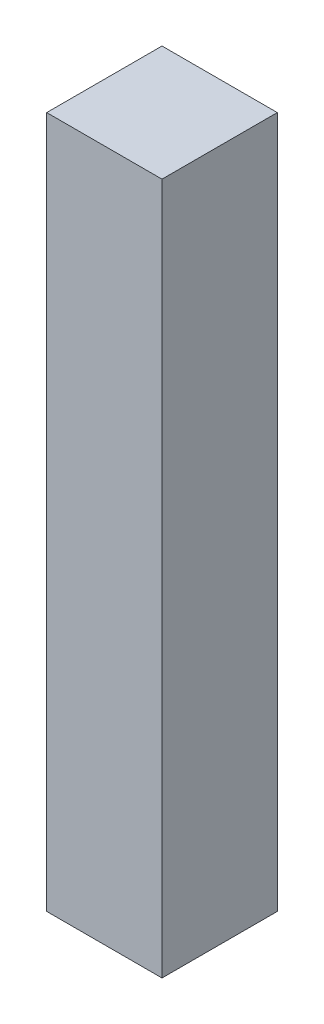
ISO-10303-21;
HEADER;
FILE_DESCRIPTION(('STEP AP214'),'2;1');
FILE_NAME('part.step','',(''),(''),'','','');
FILE_SCHEMA(('AUTOMOTIVE_DESIGN { 1 0 10303 214 1 1 1 1 }'));
ENDSEC;
DATA;
#1=APPLICATION_CONTEXT('core data for automotive mechanical design processes');
#2=APPLICATION_PROTOCOL_DEFINITION('international standard','automotive_design',2000,#1);
#3=PRODUCT_CONTEXT('',#1,'mechanical');
#4=PRODUCT('Part','Part','',(#3));
#5=PRODUCT_RELATED_PRODUCT_CATEGORY('part','',(#4));
#6=PRODUCT_DEFINITION_FORMATION('','',#4);
#7=PRODUCT_DEFINITION_CONTEXT('part definition',#1,'design');
#8=PRODUCT_DEFINITION('design','',#6,#7);
#9=PRODUCT_DEFINITION_SHAPE('','',#8);
#10=(LENGTH_UNIT() NAMED_UNIT(*) SI_UNIT(.MILLI.,.METRE.));
#11=(NAMED_UNIT(*) PLANE_ANGLE_UNIT() SI_UNIT($,.RADIAN.));
#12=(NAMED_UNIT(*) SI_UNIT($,.STERADIAN.) SOLID_ANGLE_UNIT());
#13=UNCERTAINTY_MEASURE_WITH_UNIT(LENGTH_MEASURE(1.E-05),#10,'distance_accuracy_value','');
#14=(GEOMETRIC_REPRESENTATION_CONTEXT(3) GLOBAL_UNCERTAINTY_ASSIGNED_CONTEXT((#13)) GLOBAL_UNIT_ASSIGNED_CONTEXT((#10,
#11,#12)) REPRESENTATION_CONTEXT('',''));
#15=CARTESIAN_POINT('',(0.,0.,0.));
#16=DIRECTION('',(0.,0.,1.));
#17=DIRECTION('',(1.,0.,0.));
#18=AXIS2_PLACEMENT_3D('',#15,#16,#17);
#19=CARTESIAN_POINT('',(2.5,30.,-2.5));
#20=DIRECTION('',(-1.,0.,0.));
#21=DIRECTION('',(0.,0.,1.));
#22=AXIS2_PLACEMENT_3D('',#19,#20,#21);
#23=PLANE('',#22);
#24=DIRECTION('',(0.,0.,-1.));
#25=VECTOR('',#24,1.);
#26=CARTESIAN_POINT('',(2.5,0.,-2.5));
#27=LINE('',#26,#25);
#28=CARTESIAN_POINT('',(2.5,0.,2.5));
#29=VERTEX_POINT('',#28);
#30=CARTESIAN_POINT('',(2.5,0.,-2.5));
#31=VERTEX_POINT('',#30);
#32=EDGE_CURVE('E97',#29,#31,#27,.T.);
#33=ORIENTED_EDGE('',*,*,#32,.T.);
#34=DIRECTION('',(0.,-1.,0.));
#35=VECTOR('',#34,1.);
#36=CARTESIAN_POINT('',(2.5,30.,-2.5));
#37=LINE('',#36,#35);
#38=CARTESIAN_POINT('',(2.5,30.,-2.5));
#39=VERTEX_POINT('',#38);
#40=EDGE_CURVE('E11',#39,#31,#37,.T.);
#41=ORIENTED_EDGE('',*,*,#40,.F.);
#42=DIRECTION('',(0.,0.,-1.));
#43=VECTOR('',#42,1.);
#44=CARTESIAN_POINT('',(2.5,30.,-2.5));
#45=LINE('',#44,#43);
#46=CARTESIAN_POINT('',(2.5,30.,2.5));
#47=VERTEX_POINT('',#46);
#48=EDGE_CURVE('E85',#47,#39,#45,.T.);
#49=ORIENTED_EDGE('',*,*,#48,.F.);
#50=DIRECTION('',(0.,-1.,0.));
#51=VECTOR('',#50,1.);
#52=CARTESIAN_POINT('',(2.5,30.,2.5));
#53=LINE('',#52,#51);
#54=EDGE_CURVE('E93',#47,#29,#53,.T.);
#55=ORIENTED_EDGE('',*,*,#54,.T.);
#56=EDGE_LOOP('',(#33,#41,#49,#55));
#57=FACE_BOUND('',#56,.T.);
#58=ADVANCED_FACE('F34',(#57),#23,.F.);
#59=CARTESIAN_POINT('',(-2.5,30.,-2.5));
#60=DIRECTION('',(0.,0.,1.));
#61=DIRECTION('',(1.,0.,0.));
#62=AXIS2_PLACEMENT_3D('',#59,#60,#61);
#63=PLANE('',#62);
#64=DIRECTION('',(-1.,0.,0.));
#65=VECTOR('',#64,1.);
#66=CARTESIAN_POINT('',(-2.5,0.,-2.5));
#67=LINE('',#66,#65);
#68=CARTESIAN_POINT('',(-2.5,0.,-2.5));
#69=VERTEX_POINT('',#68);
#70=EDGE_CURVE('E89',#31,#69,#67,.T.);
#71=ORIENTED_EDGE('',*,*,#70,.T.);
#72=DIRECTION('',(0.,-1.,0.));
#73=VECTOR('',#72,1.);
#74=CARTESIAN_POINT('',(-2.5,30.,-2.5));
#75=LINE('',#74,#73);
#76=CARTESIAN_POINT('',(-2.5,30.,-2.5));
#77=VERTEX_POINT('',#76);
#78=EDGE_CURVE('E42',#77,#69,#75,.T.);
#79=ORIENTED_EDGE('',*,*,#78,.F.);
#80=DIRECTION('',(-1.,0.,0.));
#81=VECTOR('',#80,1.);
#82=CARTESIAN_POINT('',(-2.5,30.,-2.5));
#83=LINE('',#82,#81);
#84=EDGE_CURVE('E80',#39,#77,#83,.T.);
#85=ORIENTED_EDGE('',*,*,#84,.F.);
#86=ORIENTED_EDGE('',*,*,#40,.T.);
#87=EDGE_LOOP('',(#71,#79,#85,#86));
#88=FACE_BOUND('',#87,.T.);
#89=ADVANCED_FACE('F88',(#88),#63,.F.);
#90=CARTESIAN_POINT('',(-2.5,30.,-2.5));
#91=DIRECTION('',(1.,0.,0.));
#92=DIRECTION('',(0.,0.,-1.));
#93=AXIS2_PLACEMENT_3D('',#90,#91,#92);
#94=PLANE('',#93);
#95=DIRECTION('',(0.,0.,1.));
#96=VECTOR('',#95,1.);
#97=CARTESIAN_POINT('',(-2.5,0.,-2.5));
#98=LINE('',#97,#96);
#99=CARTESIAN_POINT('',(-2.5,0.,2.5));
#100=VERTEX_POINT('',#99);
#101=EDGE_CURVE('E67',#69,#100,#98,.T.);
#102=ORIENTED_EDGE('',*,*,#101,.T.);
#103=DIRECTION('',(0.,-1.,0.));
#104=VECTOR('',#103,1.);
#105=CARTESIAN_POINT('',(-2.5,30.,2.5));
#106=LINE('',#105,#104);
#107=CARTESIAN_POINT('',(-2.5,30.,2.5));
#108=VERTEX_POINT('',#107);
#109=EDGE_CURVE('E90',#108,#100,#106,.T.);
#110=ORIENTED_EDGE('',*,*,#109,.F.);
#111=DIRECTION('',(0.,0.,1.));
#112=VECTOR('',#111,1.);
#113=CARTESIAN_POINT('',(-2.5,30.,-2.5));
#114=LINE('',#113,#112);
#115=EDGE_CURVE('E83',#77,#108,#114,.T.);
#116=ORIENTED_EDGE('',*,*,#115,.F.);
#117=ORIENTED_EDGE('',*,*,#78,.T.);
#118=EDGE_LOOP('',(#102,#110,#116,#117));
#119=FACE_BOUND('',#118,.T.);
#120=ADVANCED_FACE('F91',(#119),#94,.F.);
#121=CARTESIAN_POINT('',(-2.5,30.,2.5));
#122=DIRECTION('',(0.,0.,-1.));
#123=DIRECTION('',(-1.,0.,0.));
#124=AXIS2_PLACEMENT_3D('',#121,#122,#123);
#125=PLANE('',#124);
#126=DIRECTION('',(1.,0.,0.));
#127=VECTOR('',#126,1.);
#128=CARTESIAN_POINT('',(-2.5,0.,2.5));
#129=LINE('',#128,#127);
#130=EDGE_CURVE('E73',#100,#29,#129,.T.);
#131=ORIENTED_EDGE('',*,*,#130,.T.);
#132=ORIENTED_EDGE('',*,*,#54,.F.);
#133=DIRECTION('',(1.,0.,0.));
#134=VECTOR('',#133,1.);
#135=CARTESIAN_POINT('',(-2.5,30.,2.5));
#136=LINE('',#135,#134);
#137=EDGE_CURVE('E50',#108,#47,#136,.T.);
#138=ORIENTED_EDGE('',*,*,#137,.F.);
#139=ORIENTED_EDGE('',*,*,#109,.T.);
#140=EDGE_LOOP('',(#131,#132,#138,#139));
#141=FACE_BOUND('',#140,.T.);
#142=ADVANCED_FACE('F104',(#141),#125,.F.);
#143=CARTESIAN_POINT('',(0.,30.,0.));
#144=DIRECTION('',(0.,1.,0.));
#145=DIRECTION('',(0.,0.,1.));
#146=AXIS2_PLACEMENT_3D('',#143,#144,#145);
#147=PLANE('',#146);
#148=ORIENTED_EDGE('',*,*,#48,.T.);
#149=ORIENTED_EDGE('',*,*,#84,.T.);
#150=ORIENTED_EDGE('',*,*,#115,.T.);
#151=ORIENTED_EDGE('',*,*,#137,.T.);
#152=EDGE_LOOP('',(#148,#149,#150,#151));
#153=FACE_BOUND('',#152,.T.);
#154=ADVANCED_FACE('F81',(#153),#147,.T.);
#155=CARTESIAN_POINT('',(0.,0.,0.));
#156=DIRECTION('',(0.,1.,0.));
#157=DIRECTION('',(0.,0.,1.));
#158=AXIS2_PLACEMENT_3D('',#155,#156,#157);
#159=PLANE('',#158);
#160=ORIENTED_EDGE('',*,*,#32,.F.);
#161=ORIENTED_EDGE('',*,*,#130,.F.);
#162=ORIENTED_EDGE('',*,*,#101,.F.);
#163=ORIENTED_EDGE('',*,*,#70,.F.);
#164=EDGE_LOOP('',(#160,#161,#162,#163));
#165=FACE_BOUND('',#164,.T.);
#166=ADVANCED_FACE('F107',(#165),#159,.F.);
#167=CLOSED_SHELL('',(#58,#89,#120,#142,#154,#166));
#168=MANIFOLD_SOLID_BREP('B2',#167);
#169=ADVANCED_BREP_SHAPE_REPRESENTATION('',(#18,#168),#14);
#170=SHAPE_DEFINITION_REPRESENTATION(#9,#169);
ENDSEC;
END-ISO-10303-21;
